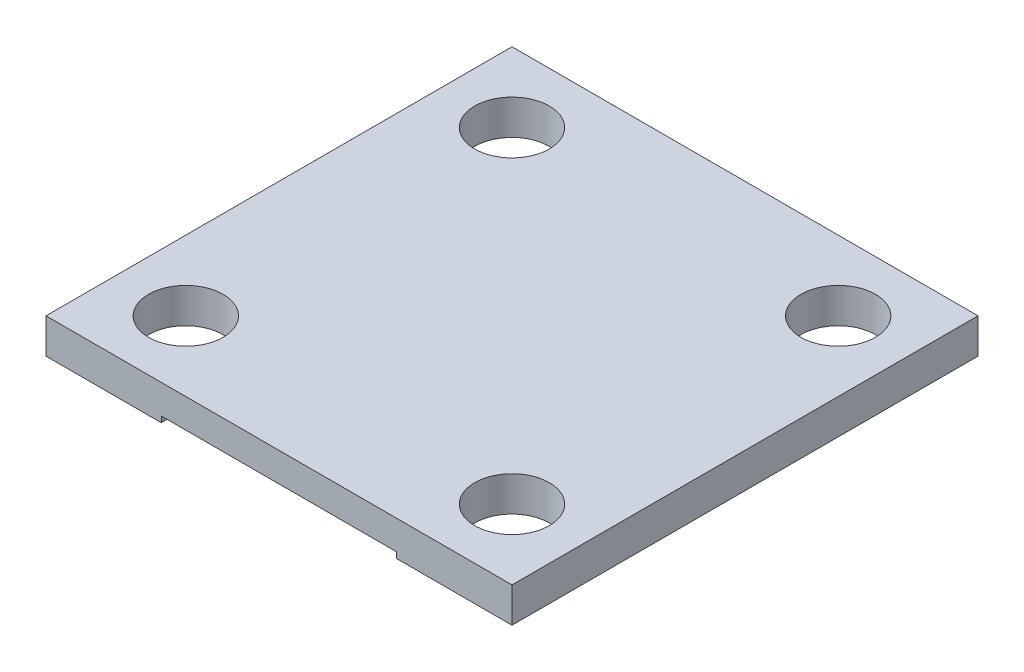
ISO-10303-21;
HEADER;
FILE_DESCRIPTION(('STEP AP214'),'2;1');
FILE_NAME('part.step','',(''),(''),'','','');
FILE_SCHEMA(('AUTOMOTIVE_DESIGN { 1 0 10303 214 1 1 1 1 }'));
ENDSEC;
DATA;
#1=APPLICATION_CONTEXT('core data for automotive mechanical design processes');
#2=APPLICATION_PROTOCOL_DEFINITION('international standard','automotive_design',2000,#1);
#3=PRODUCT_CONTEXT('',#1,'mechanical');
#4=PRODUCT('Part','Part','',(#3));
#5=PRODUCT_RELATED_PRODUCT_CATEGORY('part','',(#4));
#6=PRODUCT_DEFINITION_FORMATION('','',#4);
#7=PRODUCT_DEFINITION_CONTEXT('part definition',#1,'design');
#8=PRODUCT_DEFINITION('design','',#6,#7);
#9=PRODUCT_DEFINITION_SHAPE('','',#8);
#10=(LENGTH_UNIT() NAMED_UNIT(*) SI_UNIT(.MILLI.,.METRE.));
#11=(NAMED_UNIT(*) PLANE_ANGLE_UNIT() SI_UNIT($,.RADIAN.));
#12=(NAMED_UNIT(*) SI_UNIT($,.STERADIAN.) SOLID_ANGLE_UNIT());
#13=UNCERTAINTY_MEASURE_WITH_UNIT(LENGTH_MEASURE(1.E-05),#10,'distance_accuracy_value','');
#14=(GEOMETRIC_REPRESENTATION_CONTEXT(3) GLOBAL_UNCERTAINTY_ASSIGNED_CONTEXT((#13)) GLOBAL_UNIT_ASSIGNED_CONTEXT((#10,
#11,#12)) REPRESENTATION_CONTEXT('',''));
#15=CARTESIAN_POINT('',(0.,0.,0.));
#16=DIRECTION('',(0.,0.,1.));
#17=DIRECTION('',(1.,0.,0.));
#18=AXIS2_PLACEMENT_3D('',#15,#16,#17);
#19=CARTESIAN_POINT('',(-10.,1.5,-10.));
#20=DIRECTION('',(0.,0.,-1.));
#21=DIRECTION('',(-1.,0.,0.));
#22=AXIS2_PLACEMENT_3D('',#19,#20,#21);
#23=PLANE('',#22);
#24=DIRECTION('',(1.,0.,0.));
#25=VECTOR('',#24,1.);
#26=CARTESIAN_POINT('',(-10.,0.,-10.));
#27=LINE('',#26,#25);
#28=CARTESIAN_POINT('',(-10.,0.,-10.));
#29=VERTEX_POINT('',#28);
#30=CARTESIAN_POINT('',(10.,0.,-10.));
#31=VERTEX_POINT('',#30);
#32=EDGE_CURVE('E147',#29,#31,#27,.T.);
#33=ORIENTED_EDGE('',*,*,#32,.F.);
#34=DIRECTION('',(0.,-1.,0.));
#35=VECTOR('',#34,1.);
#36=CARTESIAN_POINT('',(-10.,1.5,-10.));
#37=LINE('',#36,#35);
#38=CARTESIAN_POINT('',(-10.,1.5,-10.));
#39=VERTEX_POINT('',#38);
#40=EDGE_CURVE('E11',#39,#29,#37,.T.);
#41=ORIENTED_EDGE('',*,*,#40,.F.);
#42=DIRECTION('',(1.,0.,0.));
#43=VECTOR('',#42,1.);
#44=CARTESIAN_POINT('',(-10.,1.5,-10.));
#45=LINE('',#44,#43);
#46=CARTESIAN_POINT('',(10.,1.5,-10.));
#47=VERTEX_POINT('',#46);
#48=EDGE_CURVE('E137',#39,#47,#45,.T.);
#49=ORIENTED_EDGE('',*,*,#48,.T.);
#50=DIRECTION('',(0.,-1.,0.));
#51=VECTOR('',#50,1.);
#52=CARTESIAN_POINT('',(10.,1.5,-10.));
#53=LINE('',#52,#51);
#54=EDGE_CURVE('E40',#47,#31,#53,.T.);
#55=ORIENTED_EDGE('',*,*,#54,.T.);
#56=EDGE_LOOP('',(#33,#41,#49,#55));
#57=FACE_BOUND('',#56,.T.);
#58=ADVANCED_FACE('F37',(#57),#23,.T.);
#59=CARTESIAN_POINT('',(-10.,1.5,10.));
#60=DIRECTION('',(-1.,0.,0.));
#61=DIRECTION('',(0.,0.,1.));
#62=AXIS2_PLACEMENT_3D('',#59,#60,#61);
#63=PLANE('',#62);
#64=DIRECTION('',(0.,0.,-1.));
#65=VECTOR('',#64,1.);
#66=CARTESIAN_POINT('',(-10.,0.,10.));
#67=LINE('',#66,#65);
#68=CARTESIAN_POINT('',(-10.,0.,10.));
#69=VERTEX_POINT('',#68);
#70=EDGE_CURVE('E140',#69,#29,#67,.T.);
#71=ORIENTED_EDGE('',*,*,#70,.F.);
#72=DIRECTION('',(0.,-1.,0.));
#73=VECTOR('',#72,1.);
#74=CARTESIAN_POINT('',(-10.,1.5,10.));
#75=LINE('',#74,#73);
#76=CARTESIAN_POINT('',(-10.,1.5,10.));
#77=VERTEX_POINT('',#76);
#78=EDGE_CURVE('E45',#77,#69,#75,.T.);
#79=ORIENTED_EDGE('',*,*,#78,.F.);
#80=DIRECTION('',(0.,0.,-1.));
#81=VECTOR('',#80,1.);
#82=CARTESIAN_POINT('',(-10.,1.5,10.));
#83=LINE('',#82,#81);
#84=EDGE_CURVE('E145',#77,#39,#83,.T.);
#85=ORIENTED_EDGE('',*,*,#84,.T.);
#86=ORIENTED_EDGE('',*,*,#40,.T.);
#87=EDGE_LOOP('',(#71,#79,#85,#86));
#88=FACE_BOUND('',#87,.T.);
#89=ADVANCED_FACE('F165',(#88),#63,.T.);
#90=CARTESIAN_POINT('',(10.,1.5,10.));
#91=DIRECTION('',(0.,0.,1.));
#92=DIRECTION('',(1.,0.,0.));
#93=AXIS2_PLACEMENT_3D('',#90,#91,#92);
#94=PLANE('',#93);
#95=DIRECTION('',(0.,-1.,0.));
#96=VECTOR('',#95,1.);
#97=CARTESIAN_POINT('',(5.05,0.25,10.));
#98=LINE('',#97,#96);
#99=CARTESIAN_POINT('',(5.05,0.25,10.));
#100=VERTEX_POINT('',#99);
#101=CARTESIAN_POINT('',(5.05,0.,10.));
#102=VERTEX_POINT('',#101);
#103=EDGE_CURVE('E151',#100,#102,#98,.T.);
#104=ORIENTED_EDGE('',*,*,#103,.T.);
#105=DIRECTION('',(-1.,0.,0.));
#106=VECTOR('',#105,1.);
#107=CARTESIAN_POINT('',(10.,0.,10.));
#108=LINE('',#107,#106);
#109=CARTESIAN_POINT('',(10.,0.,10.));
#110=VERTEX_POINT('',#109);
#111=EDGE_CURVE('E154',#110,#102,#108,.T.);
#112=ORIENTED_EDGE('',*,*,#111,.F.);
#113=DIRECTION('',(0.,-1.,0.));
#114=VECTOR('',#113,1.);
#115=CARTESIAN_POINT('',(10.,1.5,10.));
#116=LINE('',#115,#114);
#117=CARTESIAN_POINT('',(10.,1.5,10.));
#118=VERTEX_POINT('',#117);
#119=EDGE_CURVE('E159',#118,#110,#116,.T.);
#120=ORIENTED_EDGE('',*,*,#119,.F.);
#121=DIRECTION('',(-1.,0.,0.));
#122=VECTOR('',#121,1.);
#123=CARTESIAN_POINT('',(10.,1.5,10.));
#124=LINE('',#123,#122);
#125=EDGE_CURVE('E142',#118,#77,#124,.T.);
#126=ORIENTED_EDGE('',*,*,#125,.T.);
#127=ORIENTED_EDGE('',*,*,#78,.T.);
#128=CARTESIAN_POINT('',(-5.05,0.,10.));
#129=VERTEX_POINT('',#128);
#130=EDGE_CURVE('E130',#129,#69,#108,.T.);
#131=ORIENTED_EDGE('',*,*,#130,.F.);
#132=DIRECTION('',(0.,-1.,0.));
#133=VECTOR('',#132,1.);
#134=CARTESIAN_POINT('',(-5.05,0.25,10.));
#135=LINE('',#134,#133);
#136=CARTESIAN_POINT('',(-5.05,0.25,10.));
#137=VERTEX_POINT('',#136);
#138=EDGE_CURVE('E53',#137,#129,#135,.T.);
#139=ORIENTED_EDGE('',*,*,#138,.F.);
#140=DIRECTION('',(-1.,0.,0.));
#141=VECTOR('',#140,1.);
#142=CARTESIAN_POINT('',(5.05,0.25,10.));
#143=LINE('',#142,#141);
#144=EDGE_CURVE('E116',#100,#137,#143,.T.);
#145=ORIENTED_EDGE('',*,*,#144,.F.);
#146=EDGE_LOOP('',(#104,#112,#120,#126,#127,#131,#139,#145));
#147=FACE_BOUND('',#146,.T.);
#148=ADVANCED_FACE('F128',(#147),#94,.T.);
#149=CARTESIAN_POINT('',(10.,1.5,-10.));
#150=DIRECTION('',(1.,0.,0.));
#151=DIRECTION('',(0.,0.,-1.));
#152=AXIS2_PLACEMENT_3D('',#149,#150,#151);
#153=PLANE('',#152);
#154=DIRECTION('',(0.,0.,1.));
#155=VECTOR('',#154,1.);
#156=CARTESIAN_POINT('',(10.,0.,-10.));
#157=LINE('',#156,#155);
#158=EDGE_CURVE('E150',#31,#110,#157,.T.);
#159=ORIENTED_EDGE('',*,*,#158,.F.);
#160=ORIENTED_EDGE('',*,*,#54,.F.);
#161=DIRECTION('',(0.,0.,1.));
#162=VECTOR('',#161,1.);
#163=CARTESIAN_POINT('',(10.,1.5,-10.));
#164=LINE('',#163,#162);
#165=EDGE_CURVE('E139',#47,#118,#164,.T.);
#166=ORIENTED_EDGE('',*,*,#165,.T.);
#167=ORIENTED_EDGE('',*,*,#119,.T.);
#168=EDGE_LOOP('',(#159,#160,#166,#167));
#169=FACE_BOUND('',#168,.T.);
#170=ADVANCED_FACE('F161',(#169),#153,.T.);
#171=CARTESIAN_POINT('',(0.,1.5,0.));
#172=DIRECTION('',(0.,-1.,0.));
#173=DIRECTION('',(0.,0.,-1.));
#174=AXIS2_PLACEMENT_3D('',#171,#172,#173);
#175=PLANE('',#174);
#176=CARTESIAN_POINT('',(7.,1.5,7.));
#177=DIRECTION('',(0.,-1.,0.));
#178=DIRECTION('',(0.,0.,-1.));
#179=AXIS2_PLACEMENT_3D('',#176,#177,#178);
#180=CIRCLE('',#179,1.59999999999999);
#181=CARTESIAN_POINT('',(7.,1.5,5.40000000000001));
#182=VERTEX_POINT('',#181);
#183=EDGE_CURVE('E326',#182,#182,#180,.T.);
#184=ORIENTED_EDGE('',*,*,#183,.T.);
#185=EDGE_LOOP('',(#184));
#186=FACE_BOUND('',#185,.T.);
#187=CARTESIAN_POINT('',(-7.,1.5,-7.));
#188=DIRECTION('',(0.,-1.,0.));
#189=DIRECTION('',(0.,0.,-1.));
#190=AXIS2_PLACEMENT_3D('',#187,#188,#189);
#191=CIRCLE('',#190,1.59999999999999);
#192=CARTESIAN_POINT('',(-7.,1.5,-8.59999999999999));
#193=VERTEX_POINT('',#192);
#194=EDGE_CURVE('E336',#193,#193,#191,.T.);
#195=ORIENTED_EDGE('',*,*,#194,.T.);
#196=EDGE_LOOP('',(#195));
#197=FACE_BOUND('',#196,.T.);
#198=CARTESIAN_POINT('',(-7.,1.5,7.));
#199=DIRECTION('',(0.,1.,0.));
#200=DIRECTION('',(0.,0.,1.));
#201=AXIS2_PLACEMENT_3D('',#198,#199,#200);
#202=CIRCLE('',#201,1.59999999999999);
#203=CARTESIAN_POINT('',(-7.,1.5,8.59999999999999));
#204=VERTEX_POINT('',#203);
#205=EDGE_CURVE('E339',#204,#204,#202,.T.);
#206=ORIENTED_EDGE('',*,*,#205,.F.);
#207=EDGE_LOOP('',(#206));
#208=FACE_BOUND('',#207,.T.);
#209=CARTESIAN_POINT('',(7.,1.5,-7.));
#210=DIRECTION('',(0.,1.,0.));
#211=DIRECTION('',(0.,0.,1.));
#212=AXIS2_PLACEMENT_3D('',#209,#210,#211);
#213=CIRCLE('',#212,1.59999999999999);
#214=CARTESIAN_POINT('',(7.,1.5,-5.40000000000001));
#215=VERTEX_POINT('',#214);
#216=EDGE_CURVE('E345',#215,#215,#213,.T.);
#217=ORIENTED_EDGE('',*,*,#216,.F.);
#218=EDGE_LOOP('',(#217));
#219=FACE_BOUND('',#218,.T.);
#220=ORIENTED_EDGE('',*,*,#48,.F.);
#221=ORIENTED_EDGE('',*,*,#84,.F.);
#222=ORIENTED_EDGE('',*,*,#125,.F.);
#223=ORIENTED_EDGE('',*,*,#165,.F.);
#224=EDGE_LOOP('',(#220,#221,#222,#223));
#225=FACE_BOUND('',#224,.T.);
#226=ADVANCED_FACE('F169',(#186,#197,#208,#219,#225),#175,.F.);
#227=CARTESIAN_POINT('',(0.,0.,0.));
#228=DIRECTION('',(0.,-1.,0.));
#229=DIRECTION('',(0.,0.,-1.));
#230=AXIS2_PLACEMENT_3D('',#227,#228,#229);
#231=PLANE('',#230);
#232=CARTESIAN_POINT('',(7.,0.,7.));
#233=DIRECTION('',(0.,-1.,0.));
#234=DIRECTION('',(0.,0.,-1.));
#235=AXIS2_PLACEMENT_3D('',#232,#233,#234);
#236=CIRCLE('',#235,1.59999999999999);
#237=CARTESIAN_POINT('',(7.,0.,5.40000000000001));
#238=VERTEX_POINT('',#237);
#239=EDGE_CURVE('E329',#238,#238,#236,.T.);
#240=ORIENTED_EDGE('',*,*,#239,.F.);
#241=EDGE_LOOP('',(#240));
#242=FACE_BOUND('',#241,.T.);
#243=CARTESIAN_POINT('',(-7.,0.,-7.));
#244=DIRECTION('',(0.,-1.,0.));
#245=DIRECTION('',(0.,0.,-1.));
#246=AXIS2_PLACEMENT_3D('',#243,#244,#245);
#247=CIRCLE('',#246,1.59999999999999);
#248=CARTESIAN_POINT('',(-7.,0.,-8.59999999999999));
#249=VERTEX_POINT('',#248);
#250=EDGE_CURVE('E331',#249,#249,#247,.T.);
#251=ORIENTED_EDGE('',*,*,#250,.F.);
#252=EDGE_LOOP('',(#251));
#253=FACE_BOUND('',#252,.T.);
#254=CARTESIAN_POINT('',(-7.,0.,7.));
#255=DIRECTION('',(0.,1.,0.));
#256=DIRECTION('',(0.,0.,1.));
#257=AXIS2_PLACEMENT_3D('',#254,#255,#256);
#258=CIRCLE('',#257,1.59999999999999);
#259=CARTESIAN_POINT('',(-7.,0.,8.59999999999999));
#260=VERTEX_POINT('',#259);
#261=EDGE_CURVE('E342',#260,#260,#258,.T.);
#262=ORIENTED_EDGE('',*,*,#261,.T.);
#263=EDGE_LOOP('',(#262));
#264=FACE_BOUND('',#263,.T.);
#265=CARTESIAN_POINT('',(7.,0.,-7.));
#266=DIRECTION('',(0.,1.,0.));
#267=DIRECTION('',(0.,0.,1.));
#268=AXIS2_PLACEMENT_3D('',#265,#266,#267);
#269=CIRCLE('',#268,1.59999999999999);
#270=CARTESIAN_POINT('',(7.,0.,-5.40000000000001));
#271=VERTEX_POINT('',#270);
#272=EDGE_CURVE('E348',#271,#271,#269,.T.);
#273=ORIENTED_EDGE('',*,*,#272,.T.);
#274=EDGE_LOOP('',(#273));
#275=FACE_BOUND('',#274,.T.);
#276=DIRECTION('',(0.,0.,1.));
#277=VECTOR('',#276,1.);
#278=CARTESIAN_POINT('',(5.05,0.,-7.5));
#279=LINE('',#278,#277);
#280=CARTESIAN_POINT('',(5.05,0.,-7.5));
#281=VERTEX_POINT('',#280);
#282=EDGE_CURVE('E125',#281,#102,#279,.T.);
#283=ORIENTED_EDGE('',*,*,#282,.F.);
#284=DIRECTION('',(1.,0.,0.));
#285=VECTOR('',#284,1.);
#286=CARTESIAN_POINT('',(-5.05,0.,-7.5));
#287=LINE('',#286,#285);
#288=CARTESIAN_POINT('',(-5.05,0.,-7.5));
#289=VERTEX_POINT('',#288);
#290=EDGE_CURVE('E354',#289,#281,#287,.T.);
#291=ORIENTED_EDGE('',*,*,#290,.F.);
#292=DIRECTION('',(0.,0.,-1.));
#293=VECTOR('',#292,1.);
#294=CARTESIAN_POINT('',(-5.05,0.,10.));
#295=LINE('',#294,#293);
#296=EDGE_CURVE('E350',#129,#289,#295,.T.);
#297=ORIENTED_EDGE('',*,*,#296,.F.);
#298=ORIENTED_EDGE('',*,*,#130,.T.);
#299=ORIENTED_EDGE('',*,*,#70,.T.);
#300=ORIENTED_EDGE('',*,*,#32,.T.);
#301=ORIENTED_EDGE('',*,*,#158,.T.);
#302=ORIENTED_EDGE('',*,*,#111,.T.);
#303=EDGE_LOOP('',(#283,#291,#297,#298,#299,#300,#301,#302));
#304=FACE_BOUND('',#303,.T.);
#305=ADVANCED_FACE('F164',(#242,#253,#264,#275,#304),#231,.T.);
#306=CARTESIAN_POINT('',(5.05,0.25,-7.5));
#307=DIRECTION('',(1.,0.,0.));
#308=DIRECTION('',(0.,0.,-1.));
#309=AXIS2_PLACEMENT_3D('',#306,#307,#308);
#310=PLANE('',#309);
#311=ORIENTED_EDGE('',*,*,#282,.T.);
#312=ORIENTED_EDGE('',*,*,#103,.F.);
#313=DIRECTION('',(0.,0.,1.));
#314=VECTOR('',#313,1.);
#315=CARTESIAN_POINT('',(5.05,0.25,-7.5));
#316=LINE('',#315,#314);
#317=CARTESIAN_POINT('',(5.05,0.25,-7.5));
#318=VERTEX_POINT('',#317);
#319=EDGE_CURVE('E122',#318,#100,#316,.T.);
#320=ORIENTED_EDGE('',*,*,#319,.F.);
#321=DIRECTION('',(0.,-1.,0.));
#322=VECTOR('',#321,1.);
#323=CARTESIAN_POINT('',(5.05,0.25,-7.5));
#324=LINE('',#323,#322);
#325=EDGE_CURVE('E132',#318,#281,#324,.T.);
#326=ORIENTED_EDGE('',*,*,#325,.T.);
#327=EDGE_LOOP('',(#311,#312,#320,#326));
#328=FACE_BOUND('',#327,.T.);
#329=ADVANCED_FACE('F177',(#328),#310,.F.);
#330=CARTESIAN_POINT('',(-5.05,0.25,-7.5));
#331=DIRECTION('',(0.,0.,-1.));
#332=DIRECTION('',(-1.,0.,0.));
#333=AXIS2_PLACEMENT_3D('',#330,#331,#332);
#334=PLANE('',#333);
#335=ORIENTED_EDGE('',*,*,#290,.T.);
#336=ORIENTED_EDGE('',*,*,#325,.F.);
#337=DIRECTION('',(1.,0.,0.));
#338=VECTOR('',#337,1.);
#339=CARTESIAN_POINT('',(-5.05,0.25,-7.5));
#340=LINE('',#339,#338);
#341=CARTESIAN_POINT('',(-5.05,0.25,-7.5));
#342=VERTEX_POINT('',#341);
#343=EDGE_CURVE('E115',#342,#318,#340,.T.);
#344=ORIENTED_EDGE('',*,*,#343,.F.);
#345=DIRECTION('',(0.,-1.,0.));
#346=VECTOR('',#345,1.);
#347=CARTESIAN_POINT('',(-5.05,0.25,-7.5));
#348=LINE('',#347,#346);
#349=EDGE_CURVE('E111',#342,#289,#348,.T.);
#350=ORIENTED_EDGE('',*,*,#349,.T.);
#351=EDGE_LOOP('',(#335,#336,#344,#350));
#352=FACE_BOUND('',#351,.T.);
#353=ADVANCED_FACE('F237',(#352),#334,.F.);
#354=CARTESIAN_POINT('',(-5.05,0.25,10.));
#355=DIRECTION('',(-1.,0.,0.));
#356=DIRECTION('',(0.,0.,1.));
#357=AXIS2_PLACEMENT_3D('',#354,#355,#356);
#358=PLANE('',#357);
#359=ORIENTED_EDGE('',*,*,#296,.T.);
#360=ORIENTED_EDGE('',*,*,#349,.F.);
#361=DIRECTION('',(0.,0.,-1.));
#362=VECTOR('',#361,1.);
#363=CARTESIAN_POINT('',(-5.05,0.25,10.));
#364=LINE('',#363,#362);
#365=EDGE_CURVE('E108',#137,#342,#364,.T.);
#366=ORIENTED_EDGE('',*,*,#365,.F.);
#367=ORIENTED_EDGE('',*,*,#138,.T.);
#368=EDGE_LOOP('',(#359,#360,#366,#367));
#369=FACE_BOUND('',#368,.T.);
#370=ADVANCED_FACE('F110',(#369),#358,.F.);
#371=CARTESIAN_POINT('',(0.,0.25,0.));
#372=DIRECTION('',(0.,-1.,0.));
#373=DIRECTION('',(0.,0.,-1.));
#374=AXIS2_PLACEMENT_3D('',#371,#372,#373);
#375=PLANE('',#374);
#376=ORIENTED_EDGE('',*,*,#144,.T.);
#377=ORIENTED_EDGE('',*,*,#365,.T.);
#378=ORIENTED_EDGE('',*,*,#343,.T.);
#379=ORIENTED_EDGE('',*,*,#319,.T.);
#380=EDGE_LOOP('',(#376,#377,#378,#379));
#381=FACE_BOUND('',#380,.T.);
#382=ADVANCED_FACE('F120',(#381),#375,.T.);
#383=CARTESIAN_POINT('',(7.,1.5,-7.));
#384=DIRECTION('',(0.,1.,0.));
#385=DIRECTION('',(0.,0.,1.));
#386=AXIS2_PLACEMENT_3D('',#383,#384,#385);
#387=CYLINDRICAL_SURFACE('',#386,1.59999999999999);
#388=ORIENTED_EDGE('',*,*,#272,.F.);
#389=EDGE_LOOP('',(#388));
#390=FACE_BOUND('',#389,.T.);
#391=ORIENTED_EDGE('',*,*,#216,.T.);
#392=EDGE_LOOP('',(#391));
#393=FACE_BOUND('',#392,.T.);
#394=ADVANCED_FACE('F262',(#390,#393),#387,.F.);
#395=CARTESIAN_POINT('',(-7.,1.5,7.));
#396=DIRECTION('',(0.,1.,0.));
#397=DIRECTION('',(0.,0.,1.));
#398=AXIS2_PLACEMENT_3D('',#395,#396,#397);
#399=CYLINDRICAL_SURFACE('',#398,1.59999999999999);
#400=ORIENTED_EDGE('',*,*,#261,.F.);
#401=EDGE_LOOP('',(#400));
#402=FACE_BOUND('',#401,.T.);
#403=ORIENTED_EDGE('',*,*,#205,.T.);
#404=EDGE_LOOP('',(#403));
#405=FACE_BOUND('',#404,.T.);
#406=ADVANCED_FACE('F271',(#402,#405),#399,.F.);
#407=CARTESIAN_POINT('',(-7.,0.,-7.));
#408=DIRECTION('',(0.,-1.,0.));
#409=DIRECTION('',(0.,0.,-1.));
#410=AXIS2_PLACEMENT_3D('',#407,#408,#409);
#411=CYLINDRICAL_SURFACE('',#410,1.59999999999999);
#412=ORIENTED_EDGE('',*,*,#194,.F.);
#413=EDGE_LOOP('',(#412));
#414=FACE_BOUND('',#413,.T.);
#415=ORIENTED_EDGE('',*,*,#250,.T.);
#416=EDGE_LOOP('',(#415));
#417=FACE_BOUND('',#416,.T.);
#418=ADVANCED_FACE('F281',(#414,#417),#411,.F.);
#419=CARTESIAN_POINT('',(7.,0.,7.));
#420=DIRECTION('',(0.,-1.,0.));
#421=DIRECTION('',(0.,0.,-1.));
#422=AXIS2_PLACEMENT_3D('',#419,#420,#421);
#423=CYLINDRICAL_SURFACE('',#422,1.59999999999999);
#424=ORIENTED_EDGE('',*,*,#183,.F.);
#425=EDGE_LOOP('',(#424));
#426=FACE_BOUND('',#425,.T.);
#427=ORIENTED_EDGE('',*,*,#239,.T.);
#428=EDGE_LOOP('',(#427));
#429=FACE_BOUND('',#428,.T.);
#430=ADVANCED_FACE('F291',(#426,#429),#423,.F.);
#431=CLOSED_SHELL('',(#58,#89,#148,#170,#226,#305,#329,#353,#370,#382,#394,#406,#418,#430));
#432=MANIFOLD_SOLID_BREP('B2',#431);
#433=ADVANCED_BREP_SHAPE_REPRESENTATION('',(#18,#432),#14);
#434=SHAPE_DEFINITION_REPRESENTATION(#9,#433);
ENDSEC;
END-ISO-10303-21;
